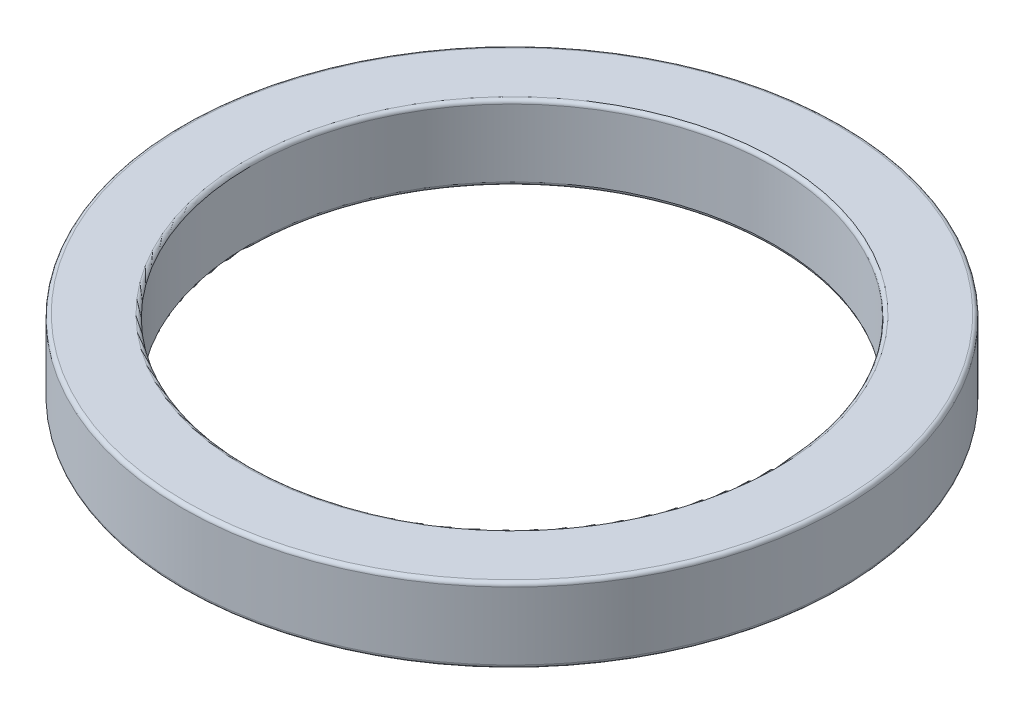
ISO-10303-21;
HEADER;
FILE_DESCRIPTION(('STEP AP214'),'2;1');
FILE_NAME('part.step','',(''),(''),'','','');
FILE_SCHEMA(('AUTOMOTIVE_DESIGN { 1 0 10303 214 1 1 1 1 }'));
ENDSEC;
DATA;
#1=APPLICATION_CONTEXT('core data for automotive mechanical design processes');
#2=APPLICATION_PROTOCOL_DEFINITION('international standard','automotive_design',2000,#1);
#3=PRODUCT_CONTEXT('',#1,'mechanical');
#4=PRODUCT('Part','Part','',(#3));
#5=PRODUCT_RELATED_PRODUCT_CATEGORY('part','',(#4));
#6=PRODUCT_DEFINITION_FORMATION('','',#4);
#7=PRODUCT_DEFINITION_CONTEXT('part definition',#1,'design');
#8=PRODUCT_DEFINITION('design','',#6,#7);
#9=PRODUCT_DEFINITION_SHAPE('','',#8);
#10=(LENGTH_UNIT() NAMED_UNIT(*) SI_UNIT(.MILLI.,.METRE.));
#11=(NAMED_UNIT(*) PLANE_ANGLE_UNIT() SI_UNIT($,.RADIAN.));
#12=(NAMED_UNIT(*) SI_UNIT($,.STERADIAN.) SOLID_ANGLE_UNIT());
#13=UNCERTAINTY_MEASURE_WITH_UNIT(LENGTH_MEASURE(1.E-05),#10,'distance_accuracy_value','');
#14=(GEOMETRIC_REPRESENTATION_CONTEXT(3) GLOBAL_UNCERTAINTY_ASSIGNED_CONTEXT((#13)) GLOBAL_UNIT_ASSIGNED_CONTEXT((#10,
#11,#12)) REPRESENTATION_CONTEXT('',''));
#15=CARTESIAN_POINT('',(0.,0.,0.));
#16=DIRECTION('',(0.,0.,1.));
#17=DIRECTION('',(1.,0.,0.));
#18=AXIS2_PLACEMENT_3D('',#15,#16,#17);
#19=CARTESIAN_POINT('',(0.,5.,0.));
#20=DIRECTION('',(0.,1.,0.));
#21=DIRECTION('',(0.,0.,1.));
#22=AXIS2_PLACEMENT_3D('',#19,#20,#21);
#23=PLANE('',#22);
#24=CARTESIAN_POINT('',(0.,5.,0.));
#25=DIRECTION('',(0.,1.,0.));
#26=DIRECTION('',(0.,0.,1.));
#27=AXIS2_PLACEMENT_3D('',#24,#25,#26);
#28=CIRCLE('',#27,17.75);
#29=CARTESIAN_POINT('',(0.,5.,17.75));
#30=VERTEX_POINT('',#29);
#31=EDGE_CURVE('E49',#30,#30,#28,.F.);
#32=ORIENTED_EDGE('',*,*,#31,.T.);
#33=EDGE_LOOP('',(#32));
#34=FACE_BOUND('',#33,.T.);
#35=CARTESIAN_POINT('',(0.,5.,0.));
#36=DIRECTION('',(0.,1.,0.));
#37=DIRECTION('',(0.,0.,1.));
#38=AXIS2_PLACEMENT_3D('',#35,#36,#37);
#39=CIRCLE('',#38,21.75);
#40=CARTESIAN_POINT('',(0.,5.,21.75));
#41=VERTEX_POINT('',#40);
#42=EDGE_CURVE('E53',#41,#41,#39,.T.);
#43=ORIENTED_EDGE('',*,*,#42,.T.);
#44=EDGE_LOOP('',(#43));
#45=FACE_BOUND('',#44,.T.);
#46=ADVANCED_FACE('F38',(#34,#45),#23,.T.);
#47=CARTESIAN_POINT('',(0.,0.,0.));
#48=DIRECTION('',(0.,1.,0.));
#49=DIRECTION('',(0.,0.,1.));
#50=AXIS2_PLACEMENT_3D('',#47,#48,#49);
#51=PLANE('',#50);
#52=CARTESIAN_POINT('',(0.,0.,0.));
#53=DIRECTION('',(0.,1.,0.));
#54=DIRECTION('',(0.,0.,1.));
#55=AXIS2_PLACEMENT_3D('',#52,#53,#54);
#56=CIRCLE('',#55,17.75);
#57=CARTESIAN_POINT('',(0.,0.,17.75));
#58=VERTEX_POINT('',#57);
#59=EDGE_CURVE('E64',#58,#58,#56,.T.);
#60=ORIENTED_EDGE('',*,*,#59,.T.);
#61=EDGE_LOOP('',(#60));
#62=FACE_BOUND('',#61,.T.);
#63=CARTESIAN_POINT('',(0.,0.,0.));
#64=DIRECTION('',(0.,1.,0.));
#65=DIRECTION('',(0.,0.,1.));
#66=AXIS2_PLACEMENT_3D('',#63,#64,#65);
#67=CIRCLE('',#66,21.75);
#68=CARTESIAN_POINT('',(0.,0.,21.75));
#69=VERTEX_POINT('',#68);
#70=EDGE_CURVE('E67',#69,#69,#67,.F.);
#71=ORIENTED_EDGE('',*,*,#70,.T.);
#72=EDGE_LOOP('',(#71));
#73=FACE_BOUND('',#72,.T.);
#74=ADVANCED_FACE('F71',(#62,#73),#51,.F.);
#75=CARTESIAN_POINT('',(0.,5.,0.));
#76=DIRECTION('',(0.,-1.,0.));
#77=DIRECTION('',(0.,0.,-1.));
#78=AXIS2_PLACEMENT_3D('',#75,#76,#77);
#79=CYLINDRICAL_SURFACE('',#78,22.);
#80=CARTESIAN_POINT('',(0.,0.25,0.));
#81=DIRECTION('',(0.,1.,0.));
#82=DIRECTION('',(0.,0.,1.));
#83=AXIS2_PLACEMENT_3D('',#80,#81,#82);
#84=CIRCLE('',#83,22.);
#85=CARTESIAN_POINT('',(0.,0.25,22.));
#86=VERTEX_POINT('',#85);
#87=EDGE_CURVE('E10',#86,#86,#84,.T.);
#88=ORIENTED_EDGE('',*,*,#87,.T.);
#89=EDGE_LOOP('',(#88));
#90=FACE_BOUND('',#89,.T.);
#91=CARTESIAN_POINT('',(0.,4.75,0.));
#92=DIRECTION('',(0.,1.,0.));
#93=DIRECTION('',(0.,0.,1.));
#94=AXIS2_PLACEMENT_3D('',#91,#92,#93);
#95=CIRCLE('',#94,22.);
#96=CARTESIAN_POINT('',(0.,4.75,22.));
#97=VERTEX_POINT('',#96);
#98=EDGE_CURVE('E45',#97,#97,#95,.F.);
#99=ORIENTED_EDGE('',*,*,#98,.T.);
#100=EDGE_LOOP('',(#99));
#101=FACE_BOUND('',#100,.T.);
#102=ADVANCED_FACE('F91',(#90,#101),#79,.T.);
#103=CARTESIAN_POINT('',(0.,5.,0.));
#104=DIRECTION('',(0.,-1.,0.));
#105=DIRECTION('',(0.,0.,-1.));
#106=AXIS2_PLACEMENT_3D('',#103,#104,#105);
#107=CYLINDRICAL_SURFACE('',#106,17.5);
#108=CARTESIAN_POINT('',(0.,0.25,0.));
#109=DIRECTION('',(0.,1.,0.));
#110=DIRECTION('',(0.,0.,1.));
#111=AXIS2_PLACEMENT_3D('',#108,#109,#110);
#112=CIRCLE('',#111,17.5);
#113=CARTESIAN_POINT('',(0.,0.25,17.5));
#114=VERTEX_POINT('',#113);
#115=EDGE_CURVE('E58',#114,#114,#112,.F.);
#116=ORIENTED_EDGE('',*,*,#115,.T.);
#117=EDGE_LOOP('',(#116));
#118=FACE_BOUND('',#117,.T.);
#119=CARTESIAN_POINT('',(0.,4.75,0.));
#120=DIRECTION('',(0.,1.,0.));
#121=DIRECTION('',(0.,0.,1.));
#122=AXIS2_PLACEMENT_3D('',#119,#120,#121);
#123=CIRCLE('',#122,17.5);
#124=CARTESIAN_POINT('',(0.,4.75,17.5));
#125=VERTEX_POINT('',#124);
#126=EDGE_CURVE('E61',#125,#125,#123,.T.);
#127=ORIENTED_EDGE('',*,*,#126,.T.);
#128=EDGE_LOOP('',(#127));
#129=FACE_BOUND('',#128,.T.);
#130=ADVANCED_FACE('F96',(#118,#129),#107,.F.);
#131=CARTESIAN_POINT('',(0.,0.25,0.));
#132=DIRECTION('',(0.,1.,0.));
#133=DIRECTION('',(0.,0.,1.));
#134=AXIS2_PLACEMENT_3D('',#131,#132,#133);
#135=TOROIDAL_SURFACE('',#134,17.75,0.25);
#136=ORIENTED_EDGE('',*,*,#115,.F.);
#137=EDGE_LOOP('',(#136));
#138=FACE_BOUND('',#137,.T.);
#139=ORIENTED_EDGE('',*,*,#59,.F.);
#140=EDGE_LOOP('',(#139));
#141=FACE_BOUND('',#140,.T.);
#142=ADVANCED_FACE('F82',(#138,#141),#135,.T.);
#143=CARTESIAN_POINT('',(0.,4.75,0.));
#144=DIRECTION('',(0.,1.,0.));
#145=DIRECTION('',(0.,0.,1.));
#146=AXIS2_PLACEMENT_3D('',#143,#144,#145);
#147=TOROIDAL_SURFACE('',#146,17.75,0.25);
#148=ORIENTED_EDGE('',*,*,#31,.F.);
#149=EDGE_LOOP('',(#148));
#150=FACE_BOUND('',#149,.T.);
#151=ORIENTED_EDGE('',*,*,#126,.F.);
#152=EDGE_LOOP('',(#151));
#153=FACE_BOUND('',#152,.T.);
#154=ADVANCED_FACE('F76',(#150,#153),#147,.T.);
#155=CARTESIAN_POINT('',(0.,0.25,0.));
#156=DIRECTION('',(0.,1.,0.));
#157=DIRECTION('',(0.,0.,1.));
#158=AXIS2_PLACEMENT_3D('',#155,#156,#157);
#159=TOROIDAL_SURFACE('',#158,21.75,0.25);
#160=ORIENTED_EDGE('',*,*,#70,.F.);
#161=EDGE_LOOP('',(#160));
#162=FACE_BOUND('',#161,.T.);
#163=ORIENTED_EDGE('',*,*,#87,.F.);
#164=EDGE_LOOP('',(#163));
#165=FACE_BOUND('',#164,.T.);
#166=ADVANCED_FACE('F73',(#162,#165),#159,.T.);
#167=CARTESIAN_POINT('',(0.,4.75,0.));
#168=DIRECTION('',(0.,1.,0.));
#169=DIRECTION('',(0.,0.,1.));
#170=AXIS2_PLACEMENT_3D('',#167,#168,#169);
#171=TOROIDAL_SURFACE('',#170,21.75,0.25);
#172=ORIENTED_EDGE('',*,*,#98,.F.);
#173=EDGE_LOOP('',(#172));
#174=FACE_BOUND('',#173,.T.);
#175=ORIENTED_EDGE('',*,*,#42,.F.);
#176=EDGE_LOOP('',(#175));
#177=FACE_BOUND('',#176,.T.);
#178=ADVANCED_FACE('F40',(#174,#177),#171,.T.);
#179=CLOSED_SHELL('',(#46,#74,#102,#130,#142,#154,#166,#178));
#180=MANIFOLD_SOLID_BREP('B2',#179);
#181=ADVANCED_BREP_SHAPE_REPRESENTATION('',(#18,#180),#14);
#182=SHAPE_DEFINITION_REPRESENTATION(#9,#181);
ENDSEC;
END-ISO-10303-21;
